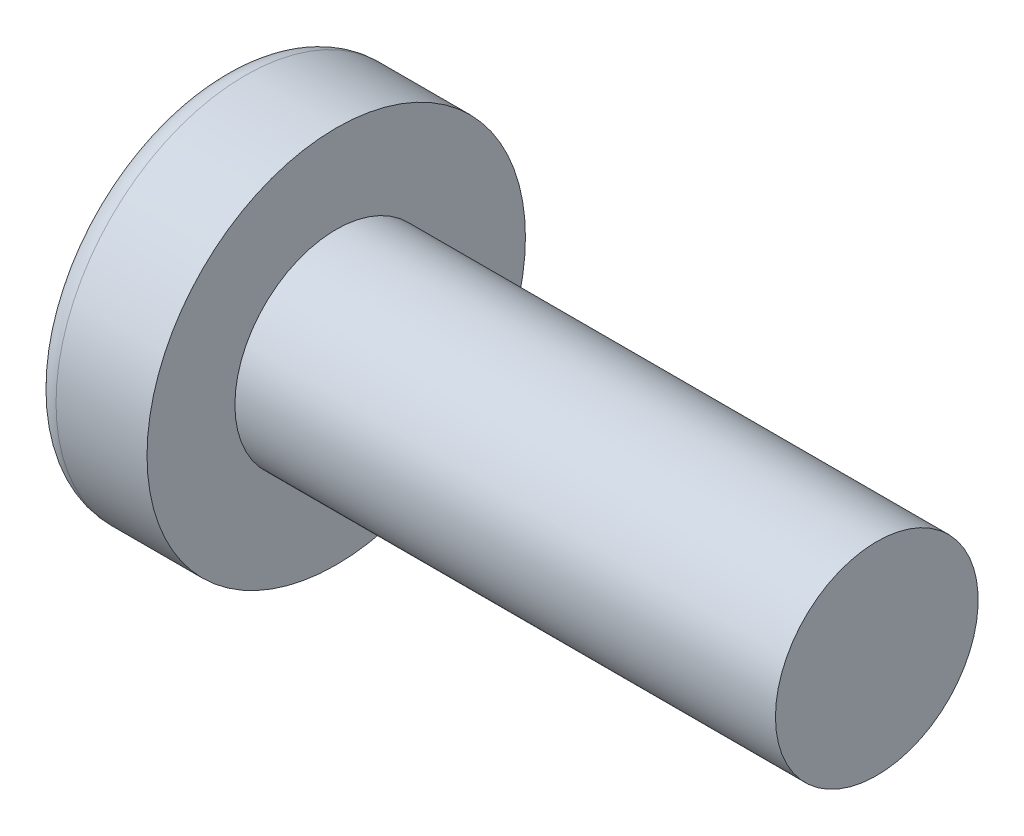
ISO-10303-21;
HEADER;
FILE_DESCRIPTION(('STEP AP214'),'2;1');
FILE_NAME('part.step','',(''),(''),'','','');
FILE_SCHEMA(('AUTOMOTIVE_DESIGN { 1 0 10303 214 1 1 1 1 }'));
ENDSEC;
DATA;
#1=APPLICATION_CONTEXT('core data for automotive mechanical design processes');
#2=APPLICATION_PROTOCOL_DEFINITION('international standard','automotive_design',2000,#1);
#3=PRODUCT_CONTEXT('',#1,'mechanical');
#4=PRODUCT('Part','Part','',(#3));
#5=PRODUCT_RELATED_PRODUCT_CATEGORY('part','',(#4));
#6=PRODUCT_DEFINITION_FORMATION('','',#4);
#7=PRODUCT_DEFINITION_CONTEXT('part definition',#1,'design');
#8=PRODUCT_DEFINITION('design','',#6,#7);
#9=PRODUCT_DEFINITION_SHAPE('','',#8);
#10=(LENGTH_UNIT() NAMED_UNIT(*) SI_UNIT(.MILLI.,.METRE.));
#11=(NAMED_UNIT(*) PLANE_ANGLE_UNIT() SI_UNIT($,.RADIAN.));
#12=(NAMED_UNIT(*) SI_UNIT($,.STERADIAN.) SOLID_ANGLE_UNIT());
#13=UNCERTAINTY_MEASURE_WITH_UNIT(LENGTH_MEASURE(1.E-05),#10,'distance_accuracy_value','');
#14=(GEOMETRIC_REPRESENTATION_CONTEXT(3) GLOBAL_UNCERTAINTY_ASSIGNED_CONTEXT((#13)) GLOBAL_UNIT_ASSIGNED_CONTEXT((#10,
#11,#12)) REPRESENTATION_CONTEXT('',''));
#15=CARTESIAN_POINT('',(0.,0.,0.));
#16=DIRECTION('',(0.,0.,1.));
#17=DIRECTION('',(1.,0.,0.));
#18=AXIS2_PLACEMENT_3D('',#15,#16,#17);
#19=CARTESIAN_POINT('',(2.01739130434783,0.,-0.15794466403162));
#20=DIRECTION('',(-0.104537710696287,0.,0.994520923380891));
#21=DIRECTION('',(0.994520923380891,0.,0.104537710696287));
#22=AXIS2_PLACEMENT_3D('',#19,#20,#21);
#23=PLANE('',#22);
#24=DIRECTION('',(-0.989130931836555,0.103971149085093,-0.103971149085093));
#25=VECTOR('',#24,1.);
#26=CARTESIAN_POINT('',(1.76,0.185000000000001,-0.184999999999999));
#27=LINE('',#26,#25);
#28=CARTESIAN_POINT('',(1.76,0.185,-0.184999999999999));
#29=VERTEX_POINT('',#28);
#30=CARTESIAN_POINT('',(0.0270341343313645,0.367158343834498,-0.367158343834493));
#31=VERTEX_POINT('',#30);
#32=EDGE_CURVE('E178',#29,#31,#27,.T.);
#33=ORIENTED_EDGE('',*,*,#32,.F.);
#34=DIRECTION('',(-0.80907355338853,0.581521616498006,-0.0850446632823174));
#35=VECTOR('',#34,1.);
#36=CARTESIAN_POINT('',(1.76,0.185,-0.185));
#37=LINE('',#36,#35);
#38=CARTESIAN_POINT('',(0.188596138461547,1.31444652548076,-0.350175974082167));
#39=VERTEX_POINT('',#38);
#40=EDGE_CURVE('E186',#29,#39,#37,.T.);
#41=ORIENTED_EDGE('',*,*,#40,.T.);
#42=CARTESIAN_POINT('',(0.188596138461549,1.31444652548076,-0.350175974082167));
#43=CARTESIAN_POINT('',(0.146535741725266,1.15917471210783,-0.354597095330013));
#44=CARTESIAN_POINT('',(0.112042043012943,1.00259812361751,-0.358222853433297));
#45=CARTESIAN_POINT('',(0.058188041636216,0.686835396402088,-0.36388364335074));
#46=CARTESIAN_POINT('',(0.0388277389718116,0.527649257676992,-0.3659186751649));
#47=CARTESIAN_POINT('',(0.0270341343313665,0.367158343834508,-0.367158343834498));
#48=B_SPLINE_CURVE_WITH_KNOTS('',3,(#42,#43,#44,#45,#46,#47),.UNSPECIFIED.,.F.,.F.,(4,2,4),(0.,
0.481116103371659,0.962232206743318),.UNSPECIFIED.);
#49=EDGE_CURVE('E21',#39,#31,#48,.T.);
#50=ORIENTED_EDGE('',*,*,#49,.T.);
#51=EDGE_LOOP('',(#33,#41,#50));
#52=FACE_BOUND('',#51,.T.);
#53=ADVANCED_FACE('F17',(#52),#23,.T.);
#54=CARTESIAN_POINT('',(1.76,0.185,0.185));
#55=DIRECTION('',(0.583636048152575,0.812015371342714,0.));
#56=DIRECTION('',(-0.812015371342714,0.583636048152575,0.));
#57=AXIS2_PLACEMENT_3D('',#54,#55,#56);
#58=PLANE('',#57);
#59=DIRECTION('',(0.,0.,1.));
#60=VECTOR('',#59,1.);
#61=CARTESIAN_POINT('',(1.76,0.185,0.185));
#62=LINE('',#61,#60);
#63=CARTESIAN_POINT('',(1.76,0.185,0.185));
#64=VERTEX_POINT('',#63);
#65=EDGE_CURVE('E86',#64,#29,#62,.F.);
#66=ORIENTED_EDGE('',*,*,#65,.F.);
#67=DIRECTION('',(0.809073553388531,-0.581521616498006,-0.085044663282317));
#68=VECTOR('',#67,1.);
#69=CARTESIAN_POINT('',(0.188596138461546,1.31444652548076,0.350175974082167));
#70=LINE('',#69,#68);
#71=CARTESIAN_POINT('',(0.188596138461546,1.31444652548076,0.350175974082166));
#72=VERTEX_POINT('',#71);
#73=EDGE_CURVE('E174',#72,#64,#70,.T.);
#74=ORIENTED_EDGE('',*,*,#73,.F.);
#75=CARTESIAN_POINT('',(0.188596138461547,1.31444652548076,-0.350175974082167));
#76=CARTESIAN_POINT('',(0.181505092768451,1.31954321457259,-0.233450649388112));
#77=CARTESIAN_POINT('',(0.177959569921917,1.32209155911854,-0.116725324694057));
#78=CARTESIAN_POINT('',(0.177959569921975,1.32209155911866,0.116725324694055));
#79=CARTESIAN_POINT('',(0.181505092768567,1.31954321457284,0.233450649388112));
#80=CARTESIAN_POINT('',(0.188596138461721,1.31444652548113,0.350175974082168));
#81=B_SPLINE_CURVE_WITH_KNOTS('',3,(#75,#76,#77,#78,#79,#80),.UNSPECIFIED.,.F.,.F.,(4,2,4),(0.,
0.35042088401523,0.70084176803046),.UNSPECIFIED.);
#82=EDGE_CURVE('E79',#39,#72,#81,.T.);
#83=ORIENTED_EDGE('',*,*,#82,.F.);
#84=ORIENTED_EDGE('',*,*,#40,.F.);
#85=EDGE_LOOP('',(#66,#74,#83,#84));
#86=FACE_BOUND('',#85,.T.);
#87=ADVANCED_FACE('F294',(#86),#58,.F.);
#88=CARTESIAN_POINT('',(2.01739130434783,0.15794466403162,0.));
#89=DIRECTION('',(-0.104537710696287,-0.994520923380891,0.));
#90=DIRECTION('',(0.994520923380891,-0.104537710696287,0.));
#91=AXIS2_PLACEMENT_3D('',#88,#89,#90);
#92=PLANE('',#91);
#93=DIRECTION('',(0.80907355338853,-0.0850446632823192,0.581521616498006));
#94=VECTOR('',#93,1.);
#95=CARTESIAN_POINT('',(0.188596138461545,0.350175974082172,-1.31444652548076));
#96=LINE('',#95,#94);
#97=CARTESIAN_POINT('',(0.188596138461547,0.350175974082171,-1.31444652548076));
#98=VERTEX_POINT('',#97);
#99=EDGE_CURVE('E165',#98,#29,#96,.T.);
#100=ORIENTED_EDGE('',*,*,#99,.T.);
#101=ORIENTED_EDGE('',*,*,#32,.T.);
#102=CARTESIAN_POINT('',(0.0270341343313625,0.367158343834489,-0.367158343834488));
#103=CARTESIAN_POINT('',(0.0388277389718086,0.365918675164897,-0.527649257676975));
#104=CARTESIAN_POINT('',(0.0581880416362137,0.363883643350741,-0.686835396402075));
#105=CARTESIAN_POINT('',(0.112042043012942,0.358222853433302,-1.0025981236175));
#106=CARTESIAN_POINT('',(0.146535741725265,0.354597095330018,-1.15917471210783));
#107=CARTESIAN_POINT('',(0.188596138461547,0.350175974082171,-1.31444652548076));
#108=B_SPLINE_CURVE_WITH_KNOTS('',3,(#102,#103,#104,#105,#106,#107),.UNSPECIFIED.,.F.,.F.,(4,2,
4),(0.,0.481116103371668,0.962232206743337),.UNSPECIFIED.);
#109=EDGE_CURVE('E183',#31,#98,#108,.T.);
#110=ORIENTED_EDGE('',*,*,#109,.T.);
#111=EDGE_LOOP('',(#100,#101,#110));
#112=FACE_BOUND('',#111,.T.);
#113=ADVANCED_FACE('F290',(#112),#92,.T.);
#114=CARTESIAN_POINT('',(2.01739130434783,0.,0.157944664031621));
#115=DIRECTION('',(-0.104537710696287,0.,-0.994520923380891));
#116=DIRECTION('',(-0.994520923380891,0.,0.104537710696287));
#117=AXIS2_PLACEMENT_3D('',#114,#115,#116);
#118=PLANE('',#117);
#119=DIRECTION('',(0.989130931836555,-0.103971149085092,-0.103971149085092));
#120=VECTOR('',#119,1.);
#121=CARTESIAN_POINT('',(0.0270341343313623,0.367158343834486,0.367158343834487));
#122=LINE('',#121,#120);
#123=CARTESIAN_POINT('',(0.0270341343313624,0.367158343834487,0.367158343834487));
#124=VERTEX_POINT('',#123);
#125=EDGE_CURVE('E159',#124,#64,#122,.T.);
#126=ORIENTED_EDGE('',*,*,#125,.F.);
#127=CARTESIAN_POINT('',(0.0270341343313624,0.367158343834487,0.367158343834487));
#128=CARTESIAN_POINT('',(0.0388277389718083,0.527649257676974,0.365918675164895));
#129=CARTESIAN_POINT('',(0.0581880416362135,0.686835396402074,0.363883643350739));
#130=CARTESIAN_POINT('',(0.112042043012942,1.0025981236175,0.358222853433298));
#131=CARTESIAN_POINT('',(0.146535741725266,1.15917471210782,0.354597095330014));
#132=CARTESIAN_POINT('',(0.188596138461549,1.31444652548076,0.350175974082165));
#133=B_SPLINE_CURVE_WITH_KNOTS('',3,(#127,#128,#129,#130,#131,#132),.UNSPECIFIED.,.F.,.F.,(4,2,
4),(0.,0.481116103371669,0.962232206743339),.UNSPECIFIED.);
#134=EDGE_CURVE('E177',#124,#72,#133,.T.);
#135=ORIENTED_EDGE('',*,*,#134,.T.);
#136=ORIENTED_EDGE('',*,*,#73,.T.);
#137=EDGE_LOOP('',(#126,#135,#136));
#138=FACE_BOUND('',#137,.T.);
#139=ADVANCED_FACE('F285',(#138),#118,.T.);
#140=CARTESIAN_POINT('',(1.76,0.185000000000001,-0.184999999999999));
#141=DIRECTION('',(0.583636048152575,0.,-0.812015371342714));
#142=DIRECTION('',(-0.812015371342714,0.,-0.583636048152575));
#143=AXIS2_PLACEMENT_3D('',#140,#141,#142);
#144=PLANE('',#143);
#145=DIRECTION('',(0.,1.,0.));
#146=VECTOR('',#145,1.);
#147=CARTESIAN_POINT('',(1.76,0.185000000000001,-0.184999999999999));
#148=LINE('',#147,#146);
#149=CARTESIAN_POINT('',(1.76,-0.185,-0.185));
#150=VERTEX_POINT('',#149);
#151=EDGE_CURVE('E110',#29,#150,#148,.F.);
#152=ORIENTED_EDGE('',*,*,#151,.F.);
#153=ORIENTED_EDGE('',*,*,#99,.F.);
#154=CARTESIAN_POINT('',(0.188596138461543,-0.350175974082162,-1.31444652548077));
#155=CARTESIAN_POINT('',(0.181505092768443,-0.233450649388107,-1.31954321457268));
#156=CARTESIAN_POINT('',(0.177959569921892,-0.116725324694051,-1.32209155911864));
#157=CARTESIAN_POINT('',(0.177959569921894,0.11672532469406,-1.32209155911864));
#158=CARTESIAN_POINT('',(0.181505092768445,0.233450649388116,-1.31954321457268));
#159=CARTESIAN_POINT('',(0.188596138461548,0.350175974082171,-1.31444652548076));
#160=B_SPLINE_CURVE_WITH_KNOTS('',3,(#154,#155,#156,#157,#158,#159),.UNSPECIFIED.,.F.,.F.,(4,2,
4),(0.,0.350420884015233,0.700841768030466),.UNSPECIFIED.);
#161=CARTESIAN_POINT('',(0.188596138461544,-0.350175974082162,-1.31444652548077));
#162=VERTEX_POINT('',#161);
#163=EDGE_CURVE('E168',#162,#98,#160,.T.);
#164=ORIENTED_EDGE('',*,*,#163,.F.);
#165=DIRECTION('',(-0.80907355338853,-0.0850446632823148,-0.581521616498007));
#166=VECTOR('',#165,1.);
#167=CARTESIAN_POINT('',(1.76,-0.184999999999999,-0.185));
#168=LINE('',#167,#166);
#169=EDGE_CURVE('E153',#150,#162,#168,.T.);
#170=ORIENTED_EDGE('',*,*,#169,.F.);
#171=EDGE_LOOP('',(#152,#153,#164,#170));
#172=FACE_BOUND('',#171,.T.);
#173=ADVANCED_FACE('F282',(#172),#144,.F.);
#174=CARTESIAN_POINT('',(2.01739130434783,0.15794466403162,0.));
#175=DIRECTION('',(-0.104537710696287,-0.994520923380891,0.));
#176=DIRECTION('',(0.994520923380891,-0.104537710696287,0.));
#177=AXIS2_PLACEMENT_3D('',#174,#175,#176);
#178=PLANE('',#177);
#179=ORIENTED_EDGE('',*,*,#125,.T.);
#180=DIRECTION('',(-0.80907355338853,0.0850446632823147,0.581521616498006));
#181=VECTOR('',#180,1.);
#182=CARTESIAN_POINT('',(1.76,0.185,0.185));
#183=LINE('',#182,#181);
#184=CARTESIAN_POINT('',(0.188596138461545,0.350175974082162,1.31444652548076));
#185=VERTEX_POINT('',#184);
#186=EDGE_CURVE('E103',#64,#185,#183,.T.);
#187=ORIENTED_EDGE('',*,*,#186,.T.);
#188=CARTESIAN_POINT('',(0.188596138461545,0.350175974082162,1.31444652548076));
#189=CARTESIAN_POINT('',(0.146535741725264,0.354597095330011,1.15917471210783));
#190=CARTESIAN_POINT('',(0.112042043012942,0.358222853433295,1.0025981236175));
#191=CARTESIAN_POINT('',(0.058188041636214,0.363883643350736,0.686835396402074));
#192=CARTESIAN_POINT('',(0.0388277389718089,0.365918675164893,0.527649257676974));
#193=CARTESIAN_POINT('',(0.0270341343313624,0.367158343834485,0.367158343834487));
#194=B_SPLINE_CURVE_WITH_KNOTS('',3,(#188,#189,#190,#191,#192,#193),.UNSPECIFIED.,.F.,.F.,(4,2,
4),(0.,0.48111610337167,0.962232206743339),.UNSPECIFIED.);
#195=EDGE_CURVE('E162',#185,#124,#194,.T.);
#196=ORIENTED_EDGE('',*,*,#195,.T.);
#197=EDGE_LOOP('',(#179,#187,#196));
#198=FACE_BOUND('',#197,.T.);
#199=ADVANCED_FACE('F256',(#198),#178,.T.);
#200=CARTESIAN_POINT('',(2.01739130434783,-0.157944664031621,0.));
#201=DIRECTION('',(-0.104537710696287,0.994520923380891,0.));
#202=DIRECTION('',(-0.994520923380891,-0.104537710696287,0.));
#203=AXIS2_PLACEMENT_3D('',#200,#201,#202);
#204=PLANE('',#203);
#205=DIRECTION('',(-0.989130931836555,-0.103971149085092,-0.103971149085092));
#206=VECTOR('',#205,1.);
#207=CARTESIAN_POINT('',(1.76,-0.185,-0.185));
#208=LINE('',#207,#206);
#209=CARTESIAN_POINT('',(0.0270341343313625,-0.367158343834486,-0.367158343834489));
#210=VERTEX_POINT('',#209);
#211=EDGE_CURVE('E144',#150,#210,#208,.T.);
#212=ORIENTED_EDGE('',*,*,#211,.F.);
#213=ORIENTED_EDGE('',*,*,#169,.T.);
#214=CARTESIAN_POINT('',(0.188596138461545,-0.350175974082162,-1.31444652548077));
#215=CARTESIAN_POINT('',(0.146535741725265,-0.35459709533001,-1.15917471210783));
#216=CARTESIAN_POINT('',(0.112042043012942,-0.358222853433295,-1.0025981236175));
#217=CARTESIAN_POINT('',(0.0581880416362149,-0.363883643350736,-0.686835396402076));
#218=CARTESIAN_POINT('',(0.0388277389718095,-0.365918675164894,-0.527649257676976));
#219=CARTESIAN_POINT('',(0.0270341343313625,-0.367158343834487,-0.367158343834488));
#220=B_SPLINE_CURVE_WITH_KNOTS('',3,(#214,#215,#216,#217,#218,#219),.UNSPECIFIED.,.F.,.F.,(4,2,
4),(0.,0.481116103371671,0.962232206743341),.UNSPECIFIED.);
#221=EDGE_CURVE('E156',#162,#210,#220,.T.);
#222=ORIENTED_EDGE('',*,*,#221,.T.);
#223=EDGE_LOOP('',(#212,#213,#222));
#224=FACE_BOUND('',#223,.T.);
#225=ADVANCED_FACE('F252',(#224),#204,.T.);
#226=CARTESIAN_POINT('',(1.76,-0.185000000000001,0.184999999999999));
#227=DIRECTION('',(0.583636048152575,0.,0.812015371342714));
#228=DIRECTION('',(0.812015371342714,0.,-0.583636048152575));
#229=AXIS2_PLACEMENT_3D('',#226,#227,#228);
#230=PLANE('',#229);
#231=DIRECTION('',(0.,1.,0.));
#232=VECTOR('',#231,1.);
#233=CARTESIAN_POINT('',(1.76,-0.185,0.185));
#234=LINE('',#233,#232);
#235=CARTESIAN_POINT('',(1.76,-0.185000000000001,0.185));
#236=VERTEX_POINT('',#235);
#237=EDGE_CURVE('E95',#64,#236,#234,.F.);
#238=ORIENTED_EDGE('',*,*,#237,.T.);
#239=DIRECTION('',(0.80907355338853,0.085044663282319,-0.581521616498006));
#240=VECTOR('',#239,1.);
#241=CARTESIAN_POINT('',(0.188596138461545,-0.350175974082172,1.31444652548076));
#242=LINE('',#241,#240);
#243=CARTESIAN_POINT('',(0.188596138461545,-0.350175974082171,1.31444652548076));
#244=VERTEX_POINT('',#243);
#245=EDGE_CURVE('E100',#244,#236,#242,.T.);
#246=ORIENTED_EDGE('',*,*,#245,.F.);
#247=CARTESIAN_POINT('',(0.188596138461545,0.350175974082162,1.31444652548076));
#248=CARTESIAN_POINT('',(0.181505092768444,0.233450649388107,1.31954321457268));
#249=CARTESIAN_POINT('',(0.177959569921893,0.116725324694051,1.32209155911864));
#250=CARTESIAN_POINT('',(0.177959569921893,-0.11672532469406,1.32209155911864));
#251=CARTESIAN_POINT('',(0.181505092768444,-0.233450649388115,1.31954321457268));
#252=CARTESIAN_POINT('',(0.188596138461545,-0.350175974082171,1.31444652548076));
#253=B_SPLINE_CURVE_WITH_KNOTS('',3,(#247,#248,#249,#250,#251,#252),.UNSPECIFIED.,.F.,.F.,(4,2,
4),(0.,0.350420884015233,0.700841768030466),.UNSPECIFIED.);
#254=EDGE_CURVE('E150',#185,#244,#253,.T.);
#255=ORIENTED_EDGE('',*,*,#254,.F.);
#256=ORIENTED_EDGE('',*,*,#186,.F.);
#257=EDGE_LOOP('',(#238,#246,#255,#256));
#258=FACE_BOUND('',#257,.T.);
#259=ADVANCED_FACE('F97',(#258),#230,.F.);
#260=CARTESIAN_POINT('',(2.01739130434783,0.,-0.15794466403162));
#261=DIRECTION('',(-0.104537710696287,0.,0.994520923380891));
#262=DIRECTION('',(0.994520923380891,0.,0.104537710696287));
#263=AXIS2_PLACEMENT_3D('',#260,#261,#262);
#264=PLANE('',#263);
#265=ORIENTED_EDGE('',*,*,#211,.T.);
#266=CARTESIAN_POINT('',(0.0270341343313625,-0.367158343834487,-0.367158343834489));
#267=CARTESIAN_POINT('',(0.0388277389718079,-0.527649257676974,-0.365918675164896));
#268=CARTESIAN_POINT('',(0.0581880416362124,-0.686835396402075,-0.363883643350739));
#269=CARTESIAN_POINT('',(0.11204204301294,-1.0025981236175,-0.358222853433299));
#270=CARTESIAN_POINT('',(0.146535741725263,-1.15917471210783,-0.354597095330015));
#271=CARTESIAN_POINT('',(0.188596138461545,-1.31444652548077,-0.350175974082168));
#272=B_SPLINE_CURVE_WITH_KNOTS('',3,(#266,#267,#268,#269,#270,#271),.UNSPECIFIED.,.F.,.F.,(4,2,
4),(0.,0.481116103371671,0.962232206743342),.UNSPECIFIED.);
#273=CARTESIAN_POINT('',(0.188596138461545,-1.31444652548077,-0.350175974082167));
#274=VERTEX_POINT('',#273);
#275=EDGE_CURVE('E105',#210,#274,#272,.T.);
#276=ORIENTED_EDGE('',*,*,#275,.T.);
#277=DIRECTION('',(0.80907355338853,0.581521616498006,0.0850446632823172));
#278=VECTOR('',#277,1.);
#279=CARTESIAN_POINT('',(0.188596138461543,-1.31444652548077,-0.350175974082167));
#280=LINE('',#279,#278);
#281=EDGE_CURVE('E113',#274,#150,#280,.T.);
#282=ORIENTED_EDGE('',*,*,#281,.T.);
#283=EDGE_LOOP('',(#265,#276,#282));
#284=FACE_BOUND('',#283,.T.);
#285=ADVANCED_FACE('F245',(#284),#264,.T.);
#286=CARTESIAN_POINT('',(1.76,-0.185,-0.185));
#287=DIRECTION('',(1.,0.,0.));
#288=DIRECTION('',(0.,0.,-1.));
#289=AXIS2_PLACEMENT_3D('',#286,#287,#288);
#290=PLANE('',#289);
#291=DIRECTION('',(0.,0.,1.));
#292=VECTOR('',#291,1.);
#293=CARTESIAN_POINT('',(1.76,-0.185,-0.185));
#294=LINE('',#293,#292);
#295=EDGE_CURVE('E108',#150,#236,#294,.T.);
#296=ORIENTED_EDGE('',*,*,#295,.T.);
#297=ORIENTED_EDGE('',*,*,#237,.F.);
#298=ORIENTED_EDGE('',*,*,#65,.T.);
#299=ORIENTED_EDGE('',*,*,#151,.T.);
#300=EDGE_LOOP('',(#296,#297,#298,#299));
#301=FACE_BOUND('',#300,.T.);
#302=ADVANCED_FACE('F109',(#301),#290,.F.);
#303=CARTESIAN_POINT('',(2.01739130434783,-0.157944664031621,0.));
#304=DIRECTION('',(-0.104537710696287,0.994520923380891,0.));
#305=DIRECTION('',(-0.994520923380891,-0.104537710696287,0.));
#306=AXIS2_PLACEMENT_3D('',#303,#304,#305);
#307=PLANE('',#306);
#308=ORIENTED_EDGE('',*,*,#245,.T.);
#309=DIRECTION('',(0.989130931836555,0.103971149085093,-0.103971149085092));
#310=VECTOR('',#309,1.);
#311=CARTESIAN_POINT('',(0.0270341343313616,-0.367158343834489,0.367158343834487));
#312=LINE('',#311,#310);
#313=CARTESIAN_POINT('',(0.027034134331362,-0.367158343834489,0.367158343834487));
#314=VERTEX_POINT('',#313);
#315=EDGE_CURVE('E112',#314,#236,#312,.T.);
#316=ORIENTED_EDGE('',*,*,#315,.F.);
#317=CARTESIAN_POINT('',(0.0270341343313625,-0.367158343834489,0.367158343834487));
#318=CARTESIAN_POINT('',(0.0388277389718091,-0.365918675164897,0.527649257676974));
#319=CARTESIAN_POINT('',(0.0581880416362142,-0.363883643350741,0.686835396402074));
#320=CARTESIAN_POINT('',(0.112042043012942,-0.358222853433302,1.0025981236175));
#321=CARTESIAN_POINT('',(0.146535741725264,-0.354597095330018,1.15917471210782));
#322=CARTESIAN_POINT('',(0.188596138461545,-0.35017597408217,1.31444652548076));
#323=B_SPLINE_CURVE_WITH_KNOTS('',3,(#317,#318,#319,#320,#321,#322),.UNSPECIFIED.,.F.,.F.,(4,2,
4),(0.,0.481116103371668,0.962232206743337),.UNSPECIFIED.);
#324=EDGE_CURVE('E104',#314,#244,#323,.T.);
#325=ORIENTED_EDGE('',*,*,#324,.T.);
#326=EDGE_LOOP('',(#308,#316,#325));
#327=FACE_BOUND('',#326,.T.);
#328=ADVANCED_FACE('F117',(#327),#307,.T.);
#329=CARTESIAN_POINT('',(1.76,-0.185,-0.185));
#330=DIRECTION('',(0.583636048152575,-0.812015371342714,0.));
#331=DIRECTION('',(0.812015371342714,0.583636048152575,0.));
#332=AXIS2_PLACEMENT_3D('',#329,#330,#331);
#333=PLANE('',#332);
#334=ORIENTED_EDGE('',*,*,#295,.F.);
#335=ORIENTED_EDGE('',*,*,#281,.F.);
#336=CARTESIAN_POINT('',(0.188596138461545,-1.31444652548076,0.350175974082166));
#337=CARTESIAN_POINT('',(0.18150509276845,-1.31954321457259,0.233450649388111));
#338=CARTESIAN_POINT('',(0.177959569921916,-1.32209155911854,0.116725324694055));
#339=CARTESIAN_POINT('',(0.177959569921974,-1.32209155911866,-0.116725324694057));
#340=CARTESIAN_POINT('',(0.181505092768565,-1.31954321457284,-0.233450649388113));
#341=CARTESIAN_POINT('',(0.188596138461718,-1.31444652548113,-0.35017597408217));
#342=B_SPLINE_CURVE_WITH_KNOTS('',3,(#336,#337,#338,#339,#340,#341),.UNSPECIFIED.,.F.,.F.,(4,2,
4),(0.,0.350420884015231,0.700841768030461),.UNSPECIFIED.);
#343=CARTESIAN_POINT('',(0.188596138461544,-1.31444652548077,0.350175974082167));
#344=VERTEX_POINT('',#343);
#345=EDGE_CURVE('E41',#344,#274,#342,.T.);
#346=ORIENTED_EDGE('',*,*,#345,.F.);
#347=DIRECTION('',(-0.80907355338853,-0.581521616498006,0.0850446632823169));
#348=VECTOR('',#347,1.);
#349=CARTESIAN_POINT('',(1.76,-0.185000000000001,0.185));
#350=LINE('',#349,#348);
#351=EDGE_CURVE('E121',#236,#344,#350,.T.);
#352=ORIENTED_EDGE('',*,*,#351,.F.);
#353=EDGE_LOOP('',(#334,#335,#346,#352));
#354=FACE_BOUND('',#353,.T.);
#355=ADVANCED_FACE('F122',(#354),#333,.F.);
#356=CARTESIAN_POINT('',(2.01739130434783,0.,0.157944664031621));
#357=DIRECTION('',(-0.104537710696287,0.,-0.994520923380891));
#358=DIRECTION('',(-0.994520923380891,0.,0.104537710696287));
#359=AXIS2_PLACEMENT_3D('',#356,#357,#358);
#360=PLANE('',#359);
#361=ORIENTED_EDGE('',*,*,#315,.T.);
#362=ORIENTED_EDGE('',*,*,#351,.T.);
#363=CARTESIAN_POINT('',(0.0270341343313624,-0.367158343834489,0.367158343834487));
#364=CARTESIAN_POINT('',(0.0388277389718078,-0.527649257676976,0.365918675164895));
#365=CARTESIAN_POINT('',(0.0581880416362124,-0.686835396402077,0.363883643350739));
#366=CARTESIAN_POINT('',(0.11204204301294,-1.0025981236175,0.358222853433298));
#367=CARTESIAN_POINT('',(0.146535741725263,-1.15917471210783,0.354597095330014));
#368=CARTESIAN_POINT('',(0.188596138461545,-1.31444652548077,0.350175974082166));
#369=B_SPLINE_CURVE_WITH_KNOTS('',3,(#363,#364,#365,#366,#367,#368),.UNSPECIFIED.,.F.,.F.,(4,2,
4),(0.,0.48111610337167,0.96223220674334),.UNSPECIFIED.);
#370=EDGE_CURVE('E125',#314,#344,#369,.T.);
#371=ORIENTED_EDGE('',*,*,#370,.F.);
#372=EDGE_LOOP('',(#361,#362,#371));
#373=FACE_BOUND('',#372,.T.);
#374=ADVANCED_FACE('F127',(#373),#360,.T.);
#375=CARTESIAN_POINT('',(5.,0.,0.));
#376=DIRECTION('',(0.,1.,0.));
#377=DIRECTION('',(1.,0.,0.));
#378=AXIS2_PLACEMENT_3D('',#375,#376,#377);
#379=SPHERICAL_SURFACE('',#378,5.);
#380=CARTESIAN_POINT('',(0.74715070681048,0.,0.));
#381=DIRECTION('',(-1.,0.,0.));
#382=DIRECTION('',(0.,0.,1.));
#383=AXIS2_PLACEMENT_3D('',#380,#381,#382);
#384=CIRCLE('',#383,2.62931034482759);
#385=CARTESIAN_POINT('',(0.74715070681048,0.,2.62931034482759));
#386=VERTEX_POINT('',#385);
#387=EDGE_CURVE('E200',#386,#386,#384,.F.);
#388=ORIENTED_EDGE('',*,*,#387,.F.);
#389=EDGE_LOOP('',(#388));
#390=FACE_BOUND('',#389,.T.);
#391=ORIENTED_EDGE('',*,*,#370,.T.);
#392=ORIENTED_EDGE('',*,*,#345,.T.);
#393=ORIENTED_EDGE('',*,*,#275,.F.);
#394=ORIENTED_EDGE('',*,*,#221,.F.);
#395=ORIENTED_EDGE('',*,*,#163,.T.);
#396=ORIENTED_EDGE('',*,*,#109,.F.);
#397=ORIENTED_EDGE('',*,*,#49,.F.);
#398=ORIENTED_EDGE('',*,*,#82,.T.);
#399=ORIENTED_EDGE('',*,*,#134,.F.);
#400=ORIENTED_EDGE('',*,*,#195,.F.);
#401=ORIENTED_EDGE('',*,*,#254,.T.);
#402=ORIENTED_EDGE('',*,*,#324,.F.);
#403=EDGE_LOOP('',(#391,#392,#393,#394,#395,#396,#397,#398,#399,#400,#401,#402));
#404=FACE_BOUND('',#403,.T.);
#405=ADVANCED_FACE('F215',(#390,#404),#379,.T.);
#406=CARTESIAN_POINT('',(1.05335585592012,0.,0.));
#407=DIRECTION('',(-1.,0.,0.));
#408=DIRECTION('',(0.,0.,1.));
#409=AXIS2_PLACEMENT_3D('',#406,#407,#408);
#410=TOROIDAL_SURFACE('',#409,2.44,0.36);
#411=ORIENTED_EDGE('',*,*,#387,.T.);
#412=EDGE_LOOP('',(#411));
#413=FACE_BOUND('',#412,.T.);
#414=CARTESIAN_POINT('',(1.05335585592013,0.,0.));
#415=DIRECTION('',(-1.,0.,0.));
#416=DIRECTION('',(0.,0.,1.));
#417=AXIS2_PLACEMENT_3D('',#414,#415,#416);
#418=CIRCLE('',#417,2.8);
#419=CARTESIAN_POINT('',(1.05335585592013,0.,2.8));
#420=VERTEX_POINT('',#419);
#421=EDGE_CURVE('E199',#420,#420,#418,.F.);
#422=ORIENTED_EDGE('',*,*,#421,.F.);
#423=EDGE_LOOP('',(#422));
#424=FACE_BOUND('',#423,.T.);
#425=ADVANCED_FACE('F340',(#413,#424),#410,.T.);
#426=CARTESIAN_POINT('',(-25.4,0.,0.));
#427=DIRECTION('',(-1.,0.,0.));
#428=DIRECTION('',(0.,0.,1.));
#429=AXIS2_PLACEMENT_3D('',#426,#427,#428);
#430=CYLINDRICAL_SURFACE('',#429,2.8);
#431=ORIENTED_EDGE('',*,*,#421,.T.);
#432=EDGE_LOOP('',(#431));
#433=FACE_BOUND('',#432,.T.);
#434=CARTESIAN_POINT('',(2.4,0.,0.));
#435=DIRECTION('',(-1.,0.,0.));
#436=DIRECTION('',(0.,0.,1.));
#437=AXIS2_PLACEMENT_3D('',#434,#435,#436);
#438=CIRCLE('',#437,2.8);
#439=CARTESIAN_POINT('',(2.4,0.,2.8));
#440=VERTEX_POINT('',#439);
#441=EDGE_CURVE('E196',#440,#440,#438,.T.);
#442=ORIENTED_EDGE('',*,*,#441,.T.);
#443=EDGE_LOOP('',(#442));
#444=FACE_BOUND('',#443,.T.);
#445=ADVANCED_FACE('F337',(#433,#444),#430,.T.);
#446=CARTESIAN_POINT('',(10.4,1.5,0.));
#447=DIRECTION('',(1.,0.,0.));
#448=DIRECTION('',(0.,0.,-1.));
#449=AXIS2_PLACEMENT_3D('',#446,#447,#448);
#450=PLANE('',#449);
#451=CARTESIAN_POINT('',(10.4,0.,0.));
#452=DIRECTION('',(-1.,0.,0.));
#453=DIRECTION('',(0.,0.,1.));
#454=AXIS2_PLACEMENT_3D('',#451,#452,#453);
#455=CIRCLE('',#454,1.5);
#456=CARTESIAN_POINT('',(10.4,0.,1.5));
#457=VERTEX_POINT('',#456);
#458=EDGE_CURVE('E32',#457,#457,#455,.T.);
#459=ORIENTED_EDGE('',*,*,#458,.F.);
#460=EDGE_LOOP('',(#459));
#461=FACE_BOUND('',#460,.T.);
#462=ADVANCED_FACE('F330',(#461),#450,.T.);
#463=CARTESIAN_POINT('',(2.4,1.5,0.));
#464=DIRECTION('',(-1.,0.,0.));
#465=DIRECTION('',(0.,0.,1.));
#466=AXIS2_PLACEMENT_3D('',#463,#464,#465);
#467=PLANE('',#466);
#468=CARTESIAN_POINT('',(2.4,0.,0.));
#469=DIRECTION('',(-1.,0.,0.));
#470=DIRECTION('',(0.,0.,1.));
#471=AXIS2_PLACEMENT_3D('',#468,#469,#470);
#472=CIRCLE('',#471,1.5);
#473=CARTESIAN_POINT('',(2.4,0.,1.5));
#474=VERTEX_POINT('',#473);
#475=EDGE_CURVE('E11',#474,#474,#472,.F.);
#476=ORIENTED_EDGE('',*,*,#475,.F.);
#477=EDGE_LOOP('',(#476));
#478=FACE_BOUND('',#477,.T.);
#479=ORIENTED_EDGE('',*,*,#441,.F.);
#480=EDGE_LOOP('',(#479));
#481=FACE_BOUND('',#480,.T.);
#482=ADVANCED_FACE('F324',(#478,#481),#467,.F.);
#483=CARTESIAN_POINT('',(-25.4,0.,0.));
#484=DIRECTION('',(-1.,0.,0.));
#485=DIRECTION('',(0.,0.,1.));
#486=AXIS2_PLACEMENT_3D('',#483,#484,#485);
#487=CYLINDRICAL_SURFACE('',#486,1.5);
#488=ORIENTED_EDGE('',*,*,#475,.T.);
#489=EDGE_LOOP('',(#488));
#490=FACE_BOUND('',#489,.T.);
#491=ORIENTED_EDGE('',*,*,#458,.T.);
#492=EDGE_LOOP('',(#491));
#493=FACE_BOUND('',#492,.T.);
#494=ADVANCED_FACE('F322',(#490,#493),#487,.T.);
#495=CLOSED_SHELL('',(#53,#87,#113,#139,#173,#199,#225,#259,#285,#302,#328,#355,#374,#405,#425,
#445,#462,#482,#494));
#496=MANIFOLD_SOLID_BREP('B1',#495);
#497=ADVANCED_BREP_SHAPE_REPRESENTATION('',(#18,#496),#14);
#498=SHAPE_DEFINITION_REPRESENTATION(#9,#497);
ENDSEC;
END-ISO-10303-21;
